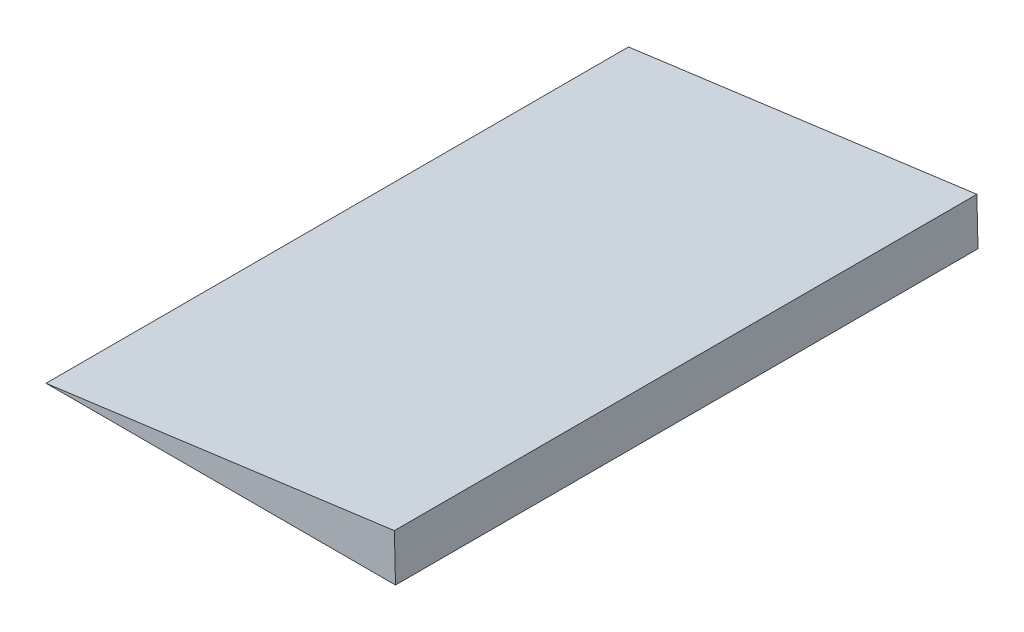
ISO-10303-21;
HEADER;
FILE_DESCRIPTION(('STEP AP214'),'2;1');
FILE_NAME('part.step','',(''),(''),'','','');
FILE_SCHEMA(('AUTOMOTIVE_DESIGN { 1 0 10303 214 1 1 1 1 }'));
ENDSEC;
DATA;
#1=APPLICATION_CONTEXT('core data for automotive mechanical design processes');
#2=APPLICATION_PROTOCOL_DEFINITION('international standard','automotive_design',2000,#1);
#3=PRODUCT_CONTEXT('',#1,'mechanical');
#4=PRODUCT('Part','Part','',(#3));
#5=PRODUCT_RELATED_PRODUCT_CATEGORY('part','',(#4));
#6=PRODUCT_DEFINITION_FORMATION('','',#4);
#7=PRODUCT_DEFINITION_CONTEXT('part definition',#1,'design');
#8=PRODUCT_DEFINITION('design','',#6,#7);
#9=PRODUCT_DEFINITION_SHAPE('','',#8);
#10=(LENGTH_UNIT() NAMED_UNIT(*) SI_UNIT(.MILLI.,.METRE.));
#11=(NAMED_UNIT(*) PLANE_ANGLE_UNIT() SI_UNIT($,.RADIAN.));
#12=(NAMED_UNIT(*) SI_UNIT($,.STERADIAN.) SOLID_ANGLE_UNIT());
#13=UNCERTAINTY_MEASURE_WITH_UNIT(LENGTH_MEASURE(1.E-05),#10,'distance_accuracy_value','');
#14=(GEOMETRIC_REPRESENTATION_CONTEXT(3) GLOBAL_UNCERTAINTY_ASSIGNED_CONTEXT((#13)) GLOBAL_UNIT_ASSIGNED_CONTEXT((#10,
#11,#12)) REPRESENTATION_CONTEXT('',''));
#15=CARTESIAN_POINT('',(0.,0.,0.));
#16=DIRECTION('',(0.,0.,1.));
#17=DIRECTION('',(1.,0.,0.));
#18=AXIS2_PLACEMENT_3D('',#15,#16,#17);
#19=CARTESIAN_POINT('',(-499.855757552496,0.,-250.));
#20=DIRECTION('',(0.999711515104992,0.0240184630332846,0.));
#21=DIRECTION('',(-0.0240184630332846,0.999711515104992,0.));
#22=AXIS2_PLACEMENT_3D('',#19,#20,#21);
#23=PLANE('',#22);
#24=DIRECTION('',(-0.0240184630332846,0.999711515104992,0.));
#25=VECTOR('',#24,1.);
#26=CARTESIAN_POINT('',(-499.855757552496,0.,0.));
#27=LINE('',#26,#25);
#28=CARTESIAN_POINT('',(-499.855757552496,0.,0.));
#29=VERTEX_POINT('',#28);
#30=CARTESIAN_POINT('',(-500.336126813162,19.9942303020998,0.));
#31=VERTEX_POINT('',#30);
#32=EDGE_CURVE('E91',#29,#31,#27,.T.);
#33=ORIENTED_EDGE('',*,*,#32,.F.);
#34=DIRECTION('',(0.,0.,1.));
#35=VECTOR('',#34,1.);
#36=CARTESIAN_POINT('',(-499.855757552496,0.,-250.));
#37=LINE('',#36,#35);
#38=CARTESIAN_POINT('',(-499.855757552496,0.,-250.));
#39=VERTEX_POINT('',#38);
#40=EDGE_CURVE('E11',#39,#29,#37,.T.);
#41=ORIENTED_EDGE('',*,*,#40,.F.);
#42=DIRECTION('',(-0.0240184630332846,0.999711515104992,0.));
#43=VECTOR('',#42,1.);
#44=CARTESIAN_POINT('',(-499.855757552496,0.,-250.));
#45=LINE('',#44,#43);
#46=CARTESIAN_POINT('',(-500.336126813162,19.9942303020998,-250.));
#47=VERTEX_POINT('',#46);
#48=EDGE_CURVE('E83',#39,#47,#45,.T.);
#49=ORIENTED_EDGE('',*,*,#48,.T.);
#50=DIRECTION('',(0.,0.,1.));
#51=VECTOR('',#50,1.);
#52=CARTESIAN_POINT('',(-500.336126813162,19.9942303020998,-250.));
#53=LINE('',#52,#51);
#54=EDGE_CURVE('E42',#47,#31,#53,.T.);
#55=ORIENTED_EDGE('',*,*,#54,.T.);
#56=EDGE_LOOP('',(#33,#41,#49,#55));
#57=FACE_BOUND('',#56,.T.);
#58=ADVANCED_FACE('F39',(#57),#23,.T.);
#59=CARTESIAN_POINT('',(-649.855757552496,0.,-250.));
#60=DIRECTION('',(0.,-1.,0.));
#61=DIRECTION('',(1.,0.,0.));
#62=AXIS2_PLACEMENT_3D('',#59,#60,#61);
#63=PLANE('',#62);
#64=DIRECTION('',(1.,0.,0.));
#65=VECTOR('',#64,1.);
#66=CARTESIAN_POINT('',(-649.855757552496,0.,0.));
#67=LINE('',#66,#65);
#68=CARTESIAN_POINT('',(-649.855757552496,0.,0.));
#69=VERTEX_POINT('',#68);
#70=EDGE_CURVE('E85',#69,#29,#67,.T.);
#71=ORIENTED_EDGE('',*,*,#70,.F.);
#72=DIRECTION('',(0.,0.,1.));
#73=VECTOR('',#72,1.);
#74=CARTESIAN_POINT('',(-649.855757552496,0.,-250.));
#75=LINE('',#74,#73);
#76=CARTESIAN_POINT('',(-649.855757552496,0.,-250.));
#77=VERTEX_POINT('',#76);
#78=EDGE_CURVE('E48',#77,#69,#75,.T.);
#79=ORIENTED_EDGE('',*,*,#78,.F.);
#80=DIRECTION('',(1.,0.,0.));
#81=VECTOR('',#80,1.);
#82=CARTESIAN_POINT('',(-649.855757552496,0.,-250.));
#83=LINE('',#82,#81);
#84=EDGE_CURVE('E80',#77,#39,#83,.T.);
#85=ORIENTED_EDGE('',*,*,#84,.T.);
#86=ORIENTED_EDGE('',*,*,#40,.T.);
#87=EDGE_LOOP('',(#71,#79,#85,#86));
#88=FACE_BOUND('',#87,.T.);
#89=ADVANCED_FACE('F95',(#88),#63,.T.);
#90=CARTESIAN_POINT('',(-500.336126813162,19.9942303020998,-250.));
#91=DIRECTION('',(-0.13254330167557,0.991177215830216,0.));
#92=DIRECTION('',(-0.991177215830216,-0.13254330167557,0.));
#93=AXIS2_PLACEMENT_3D('',#90,#91,#92);
#94=PLANE('',#93);
#95=DIRECTION('',(-0.991177215830216,-0.13254330167557,0.));
#96=VECTOR('',#95,1.);
#97=CARTESIAN_POINT('',(-500.336126813162,19.9942303020998,0.));
#98=LINE('',#97,#96);
#99=EDGE_CURVE('E78',#31,#69,#98,.T.);
#100=ORIENTED_EDGE('',*,*,#99,.F.);
#101=ORIENTED_EDGE('',*,*,#54,.F.);
#102=DIRECTION('',(-0.991177215830216,-0.13254330167557,0.));
#103=VECTOR('',#102,1.);
#104=CARTESIAN_POINT('',(-500.336126813162,19.9942303020998,-250.));
#105=LINE('',#104,#103);
#106=EDGE_CURVE('E76',#47,#77,#105,.T.);
#107=ORIENTED_EDGE('',*,*,#106,.T.);
#108=ORIENTED_EDGE('',*,*,#78,.T.);
#109=EDGE_LOOP('',(#100,#101,#107,#108));
#110=FACE_BOUND('',#109,.T.);
#111=ADVANCED_FACE('F75',(#110),#94,.T.);
#112=CARTESIAN_POINT('',(0.,0.,-250.));
#113=DIRECTION('',(0.,0.,-1.));
#114=DIRECTION('',(-1.,0.,0.));
#115=AXIS2_PLACEMENT_3D('',#112,#113,#114);
#116=PLANE('',#115);
#117=ORIENTED_EDGE('',*,*,#48,.F.);
#118=ORIENTED_EDGE('',*,*,#84,.F.);
#119=ORIENTED_EDGE('',*,*,#106,.F.);
#120=EDGE_LOOP('',(#117,#118,#119));
#121=FACE_BOUND('',#120,.T.);
#122=ADVANCED_FACE('F82',(#121),#116,.T.);
#123=CARTESIAN_POINT('',(0.,0.,0.));
#124=DIRECTION('',(0.,0.,-1.));
#125=DIRECTION('',(-1.,0.,0.));
#126=AXIS2_PLACEMENT_3D('',#123,#124,#125);
#127=PLANE('',#126);
#128=ORIENTED_EDGE('',*,*,#32,.T.);
#129=ORIENTED_EDGE('',*,*,#99,.T.);
#130=ORIENTED_EDGE('',*,*,#70,.T.);
#131=EDGE_LOOP('',(#128,#129,#130));
#132=FACE_BOUND('',#131,.T.);
#133=ADVANCED_FACE('F94',(#132),#127,.F.);
#134=CLOSED_SHELL('',(#58,#89,#111,#122,#133));
#135=MANIFOLD_SOLID_BREP('B2',#134);
#136=ADVANCED_BREP_SHAPE_REPRESENTATION('',(#18,#135),#14);
#137=SHAPE_DEFINITION_REPRESENTATION(#9,#136);
ENDSEC;
END-ISO-10303-21;
